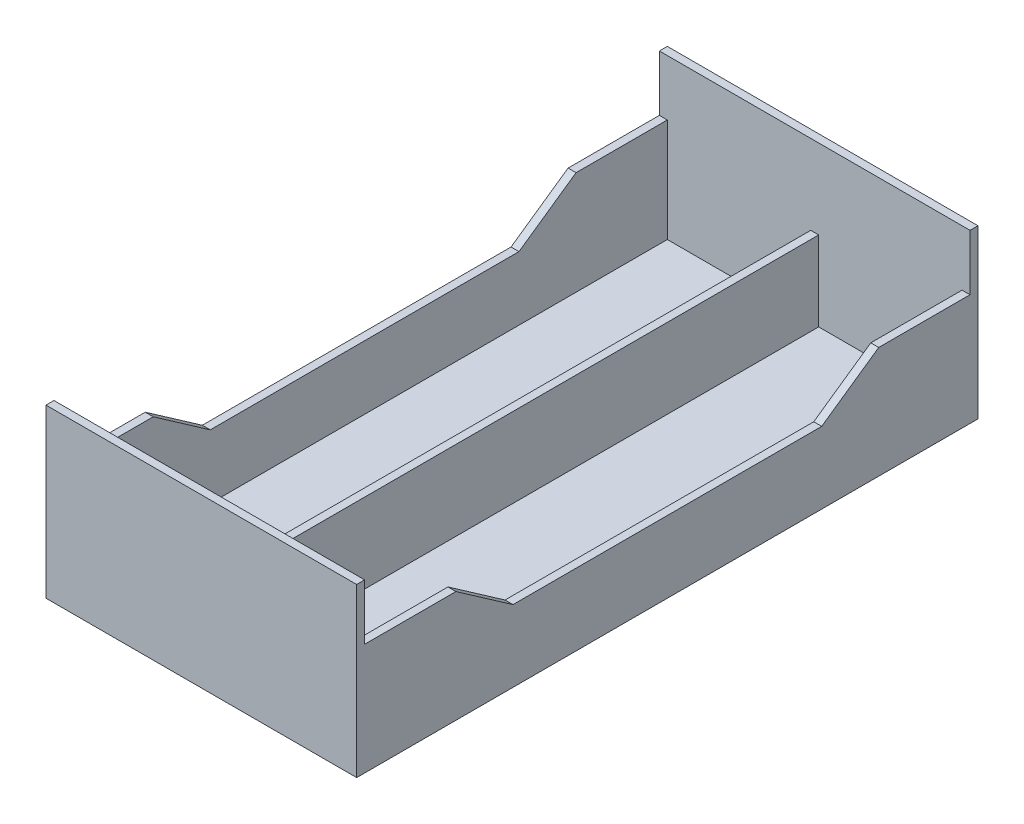
ISO-10303-21;
HEADER;
FILE_DESCRIPTION(('STEP AP214'),'2;1');
FILE_NAME('part.step','',(''),(''),'','','');
FILE_SCHEMA(('AUTOMOTIVE_DESIGN { 1 0 10303 214 1 1 1 1 }'));
ENDSEC;
DATA;
#1=APPLICATION_CONTEXT('core data for automotive mechanical design processes');
#2=APPLICATION_PROTOCOL_DEFINITION('international standard','automotive_design',2000,#1);
#3=PRODUCT_CONTEXT('',#1,'mechanical');
#4=PRODUCT('Part','Part','',(#3));
#5=PRODUCT_RELATED_PRODUCT_CATEGORY('part','',(#4));
#6=PRODUCT_DEFINITION_FORMATION('','',#4);
#7=PRODUCT_DEFINITION_CONTEXT('part definition',#1,'design');
#8=PRODUCT_DEFINITION('design','',#6,#7);
#9=PRODUCT_DEFINITION_SHAPE('','',#8);
#10=(LENGTH_UNIT() NAMED_UNIT(*) SI_UNIT(.MILLI.,.METRE.));
#11=(NAMED_UNIT(*) PLANE_ANGLE_UNIT() SI_UNIT($,.RADIAN.));
#12=(NAMED_UNIT(*) SI_UNIT($,.STERADIAN.) SOLID_ANGLE_UNIT());
#13=UNCERTAINTY_MEASURE_WITH_UNIT(LENGTH_MEASURE(1.E-05),#10,'distance_accuracy_value','');
#14=(GEOMETRIC_REPRESENTATION_CONTEXT(3) GLOBAL_UNCERTAINTY_ASSIGNED_CONTEXT((#13)) GLOBAL_UNIT_ASSIGNED_CONTEXT((#10,
#11,#12)) REPRESENTATION_CONTEXT('',''));
#15=CARTESIAN_POINT('',(0.,0.,0.));
#16=DIRECTION('',(0.,0.,1.));
#17=DIRECTION('',(1.,0.,0.));
#18=AXIS2_PLACEMENT_3D('',#15,#16,#17);
#19=CARTESIAN_POINT('',(1.,10.5,-38.));
#20=DIRECTION('',(0.,0.,-1.));
#21=DIRECTION('',(-1.,0.,0.));
#22=AXIS2_PLACEMENT_3D('',#19,#20,#21);
#23=PLANE('',#22);
#24=DIRECTION('',(0.,1.,0.));
#25=VECTOR('',#24,1.);
#26=CARTESIAN_POINT('',(20.,0.500000000000002,-38.));
#27=LINE('',#26,#25);
#28=CARTESIAN_POINT('',(20.,-9.5,-38.));
#29=VERTEX_POINT('',#28);
#30=CARTESIAN_POINT('',(20.,0.500000000000002,-38.));
#31=VERTEX_POINT('',#30);
#32=EDGE_CURVE('E201',#29,#31,#27,.T.);
#33=ORIENTED_EDGE('',*,*,#32,.F.);
#34=DIRECTION('',(-1.,0.,0.));
#35=VECTOR('',#34,1.);
#36=CARTESIAN_POINT('',(38.,-9.5,-38.));
#37=LINE('',#36,#35);
#38=CARTESIAN_POINT('',(38.,-9.5,-38.));
#39=VERTEX_POINT('',#38);
#40=EDGE_CURVE('E212',#39,#29,#37,.T.);
#41=ORIENTED_EDGE('',*,*,#40,.F.);
#42=DIRECTION('',(0.,-1.,0.));
#43=VECTOR('',#42,1.);
#44=CARTESIAN_POINT('',(38.,10.5,-38.));
#45=LINE('',#44,#43);
#46=CARTESIAN_POINT('',(38.,3.5,-38.));
#47=VERTEX_POINT('',#46);
#48=EDGE_CURVE('E234',#47,#39,#45,.T.);
#49=ORIENTED_EDGE('',*,*,#48,.F.);
#50=DIRECTION('',(1.,0.,0.));
#51=VECTOR('',#50,1.);
#52=CARTESIAN_POINT('',(38.,3.5,-38.));
#53=LINE('',#52,#51);
#54=CARTESIAN_POINT('',(39.,3.5,-38.));
#55=VERTEX_POINT('',#54);
#56=EDGE_CURVE('E298',#47,#55,#53,.T.);
#57=ORIENTED_EDGE('',*,*,#56,.T.);
#58=DIRECTION('',(0.,-1.,0.));
#59=VECTOR('',#58,1.);
#60=CARTESIAN_POINT('',(39.,10.5,-38.));
#61=LINE('',#60,#59);
#62=CARTESIAN_POINT('',(39.,10.5,-38.));
#63=VERTEX_POINT('',#62);
#64=EDGE_CURVE('E347',#63,#55,#61,.T.);
#65=ORIENTED_EDGE('',*,*,#64,.F.);
#66=DIRECTION('',(-1.,0.,0.));
#67=VECTOR('',#66,1.);
#68=CARTESIAN_POINT('',(1.,10.5,-38.));
#69=LINE('',#68,#67);
#70=CARTESIAN_POINT('',(0.,10.5,-38.));
#71=VERTEX_POINT('',#70);
#72=EDGE_CURVE('E247',#63,#71,#69,.T.);
#73=ORIENTED_EDGE('',*,*,#72,.T.);
#74=DIRECTION('',(0.,-1.,0.));
#75=VECTOR('',#74,1.);
#76=CARTESIAN_POINT('',(0.,10.5,-38.));
#77=LINE('',#76,#75);
#78=CARTESIAN_POINT('',(0.,3.5,-38.));
#79=VERTEX_POINT('',#78);
#80=EDGE_CURVE('E448',#71,#79,#77,.T.);
#81=ORIENTED_EDGE('',*,*,#80,.T.);
#82=DIRECTION('',(-1.,0.,0.));
#83=VECTOR('',#82,1.);
#84=CARTESIAN_POINT('',(1.,3.5,-38.));
#85=LINE('',#84,#83);
#86=CARTESIAN_POINT('',(1.,3.5,-38.));
#87=VERTEX_POINT('',#86);
#88=EDGE_CURVE('E244',#87,#79,#85,.T.);
#89=ORIENTED_EDGE('',*,*,#88,.F.);
#90=DIRECTION('',(0.,-1.,0.));
#91=VECTOR('',#90,1.);
#92=CARTESIAN_POINT('',(1.,10.5,-38.));
#93=LINE('',#92,#91);
#94=CARTESIAN_POINT('',(1.,-9.5,-38.));
#95=VERTEX_POINT('',#94);
#96=EDGE_CURVE('E11',#87,#95,#93,.T.);
#97=ORIENTED_EDGE('',*,*,#96,.T.);
#98=CARTESIAN_POINT('',(19.,-9.5,-38.));
#99=VERTEX_POINT('',#98);
#100=EDGE_CURVE('E221',#99,#95,#37,.T.);
#101=ORIENTED_EDGE('',*,*,#100,.F.);
#102=DIRECTION('',(0.,1.,0.));
#103=VECTOR('',#102,1.);
#104=CARTESIAN_POINT('',(19.,0.500000000000002,-38.));
#105=LINE('',#104,#103);
#106=CARTESIAN_POINT('',(19.,0.500000000000002,-38.));
#107=VERTEX_POINT('',#106);
#108=EDGE_CURVE('E50',#99,#107,#105,.T.);
#109=ORIENTED_EDGE('',*,*,#108,.T.);
#110=DIRECTION('',(-1.,0.,0.));
#111=VECTOR('',#110,1.);
#112=CARTESIAN_POINT('',(20.,0.500000000000002,-38.));
#113=LINE('',#112,#111);
#114=EDGE_CURVE('E214',#31,#107,#113,.T.);
#115=ORIENTED_EDGE('',*,*,#114,.F.);
#116=EDGE_LOOP('',(#33,#41,#49,#57,#65,#73,#81,#89,#97,#101,#109,#115));
#117=FACE_BOUND('',#116,.T.);
#118=ADVANCED_FACE('F33',(#117),#23,.F.);
#119=CARTESIAN_POINT('',(1.,10.5,38.));
#120=DIRECTION('',(0.,0.,1.));
#121=DIRECTION('',(1.,0.,0.));
#122=AXIS2_PLACEMENT_3D('',#119,#120,#121);
#123=PLANE('',#122);
#124=DIRECTION('',(0.,-1.,0.));
#125=VECTOR('',#124,1.);
#126=CARTESIAN_POINT('',(20.,-9.5,38.));
#127=LINE('',#126,#125);
#128=CARTESIAN_POINT('',(20.,0.500000000000002,38.));
#129=VERTEX_POINT('',#128);
#130=CARTESIAN_POINT('',(20.,-9.5,38.));
#131=VERTEX_POINT('',#130);
#132=EDGE_CURVE('E204',#129,#131,#127,.T.);
#133=ORIENTED_EDGE('',*,*,#132,.F.);
#134=DIRECTION('',(-1.,0.,0.));
#135=VECTOR('',#134,1.);
#136=CARTESIAN_POINT('',(20.,0.500000000000002,38.));
#137=LINE('',#136,#135);
#138=CARTESIAN_POINT('',(19.,0.500000000000002,38.));
#139=VERTEX_POINT('',#138);
#140=EDGE_CURVE('E371',#129,#139,#137,.T.);
#141=ORIENTED_EDGE('',*,*,#140,.T.);
#142=DIRECTION('',(0.,-1.,0.));
#143=VECTOR('',#142,1.);
#144=CARTESIAN_POINT('',(19.,-9.5,38.));
#145=LINE('',#144,#143);
#146=CARTESIAN_POINT('',(19.,-9.5,38.));
#147=VERTEX_POINT('',#146);
#148=EDGE_CURVE('E208',#139,#147,#145,.T.);
#149=ORIENTED_EDGE('',*,*,#148,.T.);
#150=DIRECTION('',(-1.,0.,0.));
#151=VECTOR('',#150,1.);
#152=CARTESIAN_POINT('',(38.,-9.5,38.));
#153=LINE('',#152,#151);
#154=CARTESIAN_POINT('',(1.,-9.5,38.));
#155=VERTEX_POINT('',#154);
#156=EDGE_CURVE('E388',#147,#155,#153,.T.);
#157=ORIENTED_EDGE('',*,*,#156,.T.);
#158=DIRECTION('',(0.,1.,0.));
#159=VECTOR('',#158,1.);
#160=CARTESIAN_POINT('',(1.,10.5,38.));
#161=LINE('',#160,#159);
#162=CARTESIAN_POINT('',(1.,3.5,38.));
#163=VERTEX_POINT('',#162);
#164=EDGE_CURVE('E230',#155,#163,#161,.T.);
#165=ORIENTED_EDGE('',*,*,#164,.T.);
#166=DIRECTION('',(-1.,0.,0.));
#167=VECTOR('',#166,1.);
#168=CARTESIAN_POINT('',(1.,3.5,38.));
#169=LINE('',#168,#167);
#170=CARTESIAN_POINT('',(0.,3.5,38.));
#171=VERTEX_POINT('',#170);
#172=EDGE_CURVE('E262',#163,#171,#169,.T.);
#173=ORIENTED_EDGE('',*,*,#172,.T.);
#174=DIRECTION('',(0.,1.,0.));
#175=VECTOR('',#174,1.);
#176=CARTESIAN_POINT('',(0.,10.5,38.));
#177=LINE('',#176,#175);
#178=CARTESIAN_POINT('',(0.,10.5,38.));
#179=VERTEX_POINT('',#178);
#180=EDGE_CURVE('E402',#171,#179,#177,.T.);
#181=ORIENTED_EDGE('',*,*,#180,.T.);
#182=DIRECTION('',(-1.,0.,0.));
#183=VECTOR('',#182,1.);
#184=CARTESIAN_POINT('',(1.,10.5,38.));
#185=LINE('',#184,#183);
#186=CARTESIAN_POINT('',(39.,10.5,38.));
#187=VERTEX_POINT('',#186);
#188=EDGE_CURVE('E266',#187,#179,#185,.T.);
#189=ORIENTED_EDGE('',*,*,#188,.F.);
#190=DIRECTION('',(0.,1.,0.));
#191=VECTOR('',#190,1.);
#192=CARTESIAN_POINT('',(39.,10.5,38.));
#193=LINE('',#192,#191);
#194=CARTESIAN_POINT('',(39.,3.5,38.));
#195=VERTEX_POINT('',#194);
#196=EDGE_CURVE('E329',#195,#187,#193,.T.);
#197=ORIENTED_EDGE('',*,*,#196,.F.);
#198=DIRECTION('',(1.,0.,0.));
#199=VECTOR('',#198,1.);
#200=CARTESIAN_POINT('',(38.,3.5,38.));
#201=LINE('',#200,#199);
#202=CARTESIAN_POINT('',(38.,3.5,38.));
#203=VERTEX_POINT('',#202);
#204=EDGE_CURVE('E280',#203,#195,#201,.T.);
#205=ORIENTED_EDGE('',*,*,#204,.F.);
#206=DIRECTION('',(0.,1.,0.));
#207=VECTOR('',#206,1.);
#208=CARTESIAN_POINT('',(38.,10.5,38.));
#209=LINE('',#208,#207);
#210=CARTESIAN_POINT('',(38.,-9.5,38.));
#211=VERTEX_POINT('',#210);
#212=EDGE_CURVE('E58',#211,#203,#209,.T.);
#213=ORIENTED_EDGE('',*,*,#212,.F.);
#214=EDGE_CURVE('E226',#211,#131,#153,.T.);
#215=ORIENTED_EDGE('',*,*,#214,.T.);
#216=EDGE_LOOP('',(#133,#141,#149,#157,#165,#173,#181,#189,#197,#205,#213,#215));
#217=FACE_BOUND('',#216,.T.);
#218=ADVANCED_FACE('F387',(#217),#123,.F.);
#219=CARTESIAN_POINT('',(38.,-9.5,-38.));
#220=DIRECTION('',(0.,-1.,0.));
#221=DIRECTION('',(0.,0.,-1.));
#222=AXIS2_PLACEMENT_3D('',#219,#220,#221);
#223=PLANE('',#222);
#224=DIRECTION('',(0.,0.,-1.));
#225=VECTOR('',#224,1.);
#226=CARTESIAN_POINT('',(20.,-9.5,38.));
#227=LINE('',#226,#225);
#228=EDGE_CURVE('E198',#131,#29,#227,.T.);
#229=ORIENTED_EDGE('',*,*,#228,.F.);
#230=ORIENTED_EDGE('',*,*,#214,.F.);
#231=DIRECTION('',(0.,0.,1.));
#232=VECTOR('',#231,1.);
#233=CARTESIAN_POINT('',(38.,-9.5,-38.));
#234=LINE('',#233,#232);
#235=EDGE_CURVE('E218',#39,#211,#234,.T.);
#236=ORIENTED_EDGE('',*,*,#235,.F.);
#237=ORIENTED_EDGE('',*,*,#40,.T.);
#238=EDGE_LOOP('',(#229,#230,#236,#237));
#239=FACE_BOUND('',#238,.T.);
#240=ADVANCED_FACE('F217',(#239),#223,.F.);
#241=CARTESIAN_POINT('',(1.,10.5,-39.));
#242=DIRECTION('',(0.,0.,1.));
#243=DIRECTION('',(1.,0.,0.));
#244=AXIS2_PLACEMENT_3D('',#241,#242,#243);
#245=PLANE('',#244);
#246=DIRECTION('',(0.,1.,0.));
#247=VECTOR('',#246,1.);
#248=CARTESIAN_POINT('',(0.,10.5,-39.));
#249=LINE('',#248,#247);
#250=CARTESIAN_POINT('',(0.,-10.5,-39.));
#251=VERTEX_POINT('',#250);
#252=CARTESIAN_POINT('',(0.,10.5,-39.));
#253=VERTEX_POINT('',#252);
#254=EDGE_CURVE('E220',#251,#253,#249,.T.);
#255=ORIENTED_EDGE('',*,*,#254,.T.);
#256=DIRECTION('',(-1.,0.,0.));
#257=VECTOR('',#256,1.);
#258=CARTESIAN_POINT('',(1.,10.5,-39.));
#259=LINE('',#258,#257);
#260=CARTESIAN_POINT('',(39.,10.5,-39.));
#261=VERTEX_POINT('',#260);
#262=EDGE_CURVE('E42',#261,#253,#259,.T.);
#263=ORIENTED_EDGE('',*,*,#262,.F.);
#264=DIRECTION('',(0.,1.,0.));
#265=VECTOR('',#264,1.);
#266=CARTESIAN_POINT('',(39.,10.5,-39.));
#267=LINE('',#266,#265);
#268=CARTESIAN_POINT('',(39.,-10.5,-39.));
#269=VERTEX_POINT('',#268);
#270=EDGE_CURVE('E317',#269,#261,#267,.T.);
#271=ORIENTED_EDGE('',*,*,#270,.F.);
#272=DIRECTION('',(-1.,0.,0.));
#273=VECTOR('',#272,1.);
#274=CARTESIAN_POINT('',(1.,-10.5,-39.));
#275=LINE('',#274,#273);
#276=EDGE_CURVE('E258',#269,#251,#275,.T.);
#277=ORIENTED_EDGE('',*,*,#276,.T.);
#278=EDGE_LOOP('',(#255,#263,#271,#277));
#279=FACE_BOUND('',#278,.T.);
#280=ADVANCED_FACE('F35',(#279),#245,.F.);
#281=CARTESIAN_POINT('',(1.,10.5,-39.));
#282=DIRECTION('',(0.,-1.,0.));
#283=DIRECTION('',(0.,0.,-1.));
#284=AXIS2_PLACEMENT_3D('',#281,#282,#283);
#285=PLANE('',#284);
#286=DIRECTION('',(0.,0.,1.));
#287=VECTOR('',#286,1.);
#288=CARTESIAN_POINT('',(0.,10.5,-39.));
#289=LINE('',#288,#287);
#290=EDGE_CURVE('E224',#253,#71,#289,.T.);
#291=ORIENTED_EDGE('',*,*,#290,.T.);
#292=ORIENTED_EDGE('',*,*,#72,.F.);
#293=DIRECTION('',(0.,0.,1.));
#294=VECTOR('',#293,1.);
#295=CARTESIAN_POINT('',(39.,10.5,-39.));
#296=LINE('',#295,#294);
#297=EDGE_CURVE('E295',#261,#63,#296,.T.);
#298=ORIENTED_EDGE('',*,*,#297,.F.);
#299=ORIENTED_EDGE('',*,*,#262,.T.);
#300=EDGE_LOOP('',(#291,#292,#298,#299));
#301=FACE_BOUND('',#300,.T.);
#302=ADVANCED_FACE('F443',(#301),#285,.F.);
#303=CARTESIAN_POINT('',(1.,3.5,-38.));
#304=DIRECTION('',(0.,-1.,0.));
#305=DIRECTION('',(0.,0.,-1.));
#306=AXIS2_PLACEMENT_3D('',#303,#304,#305);
#307=PLANE('',#306);
#308=DIRECTION('',(0.,0.,1.));
#309=VECTOR('',#308,1.);
#310=CARTESIAN_POINT('',(0.,3.5,-38.));
#311=LINE('',#310,#309);
#312=CARTESIAN_POINT('',(0.,3.5,-26.539616882052));
#313=VERTEX_POINT('',#312);
#314=EDGE_CURVE('E450',#79,#313,#311,.T.);
#315=ORIENTED_EDGE('',*,*,#314,.T.);
#316=DIRECTION('',(-1.,0.,0.));
#317=VECTOR('',#316,1.);
#318=CARTESIAN_POINT('',(1.,3.5,-26.539616882052));
#319=LINE('',#318,#317);
#320=CARTESIAN_POINT('',(1.,3.5,-26.539616882052));
#321=VERTEX_POINT('',#320);
#322=EDGE_CURVE('E248',#321,#313,#319,.T.);
#323=ORIENTED_EDGE('',*,*,#322,.F.);
#324=DIRECTION('',(0.,0.,1.));
#325=VECTOR('',#324,1.);
#326=CARTESIAN_POINT('',(1.,3.5,-38.));
#327=LINE('',#326,#325);
#328=EDGE_CURVE('E251',#87,#321,#327,.T.);
#329=ORIENTED_EDGE('',*,*,#328,.F.);
#330=ORIENTED_EDGE('',*,*,#88,.T.);
#331=EDGE_LOOP('',(#315,#323,#329,#330));
#332=FACE_BOUND('',#331,.T.);
#333=ADVANCED_FACE('F474',(#332),#307,.F.);
#334=CARTESIAN_POINT('',(1.,3.5,-26.539616882052));
#335=DIRECTION('',(0.,-0.819979737695976,-0.572392548665719));
#336=DIRECTION('',(0.,0.572392548665719,-0.819979737695977));
#337=AXIS2_PLACEMENT_3D('',#334,#335,#336);
#338=PLANE('',#337);
#339=DIRECTION('',(0.,-0.572392548665719,0.819979737695976));
#340=VECTOR('',#339,1.);
#341=CARTESIAN_POINT('',(0.,3.5,-26.539616882052));
#342=LINE('',#341,#340);
#343=CARTESIAN_POINT('',(0.,-1.5,-19.3768774333346));
#344=VERTEX_POINT('',#343);
#345=EDGE_CURVE('E455',#313,#344,#342,.T.);
#346=ORIENTED_EDGE('',*,*,#345,.T.);
#347=DIRECTION('',(-1.,0.,0.));
#348=VECTOR('',#347,1.);
#349=CARTESIAN_POINT('',(1.,-1.5,-19.3768774333346));
#350=LINE('',#349,#348);
#351=CARTESIAN_POINT('',(1.,-1.5,-19.3768774333346));
#352=VERTEX_POINT('',#351);
#353=EDGE_CURVE('E433',#352,#344,#350,.T.);
#354=ORIENTED_EDGE('',*,*,#353,.F.);
#355=DIRECTION('',(0.,-0.572392548665719,0.819979737695976));
#356=VECTOR('',#355,1.);
#357=CARTESIAN_POINT('',(1.,3.5,-26.539616882052));
#358=LINE('',#357,#356);
#359=EDGE_CURVE('E236',#321,#352,#358,.T.);
#360=ORIENTED_EDGE('',*,*,#359,.F.);
#361=ORIENTED_EDGE('',*,*,#322,.T.);
#362=EDGE_LOOP('',(#346,#354,#360,#361));
#363=FACE_BOUND('',#362,.T.);
#364=ADVANCED_FACE('F470',(#363),#338,.F.);
#365=CARTESIAN_POINT('',(1.,-1.5,19.3768774333346));
#366=DIRECTION('',(0.,-1.,0.));
#367=DIRECTION('',(0.,0.,-1.));
#368=AXIS2_PLACEMENT_3D('',#365,#366,#367);
#369=PLANE('',#368);
#370=DIRECTION('',(0.,0.,1.));
#371=VECTOR('',#370,1.);
#372=CARTESIAN_POINT('',(0.,-1.5,19.3768774333346));
#373=LINE('',#372,#371);
#374=CARTESIAN_POINT('',(0.,-1.5,19.3768774333346));
#375=VERTEX_POINT('',#374);
#376=EDGE_CURVE('E457',#344,#375,#373,.T.);
#377=ORIENTED_EDGE('',*,*,#376,.T.);
#378=DIRECTION('',(-1.,0.,0.));
#379=VECTOR('',#378,1.);
#380=CARTESIAN_POINT('',(1.,-1.5,19.3768774333346));
#381=LINE('',#380,#379);
#382=CARTESIAN_POINT('',(1.,-1.5,19.3768774333346));
#383=VERTEX_POINT('',#382);
#384=EDGE_CURVE('E430',#383,#375,#381,.T.);
#385=ORIENTED_EDGE('',*,*,#384,.F.);
#386=DIRECTION('',(0.,0.,1.));
#387=VECTOR('',#386,1.);
#388=CARTESIAN_POINT('',(1.,-1.5,19.3768774333346));
#389=LINE('',#388,#387);
#390=EDGE_CURVE('E467',#352,#383,#389,.T.);
#391=ORIENTED_EDGE('',*,*,#390,.F.);
#392=ORIENTED_EDGE('',*,*,#353,.T.);
#393=EDGE_LOOP('',(#377,#385,#391,#392));
#394=FACE_BOUND('',#393,.T.);
#395=ADVANCED_FACE('F464',(#394),#369,.F.);
#396=CARTESIAN_POINT('',(1.,3.5,26.539616882052));
#397=DIRECTION('',(0.,-0.819979737695976,0.572392548665719));
#398=DIRECTION('',(0.,-0.572392548665719,-0.819979737695977));
#399=AXIS2_PLACEMENT_3D('',#396,#397,#398);
#400=PLANE('',#399);
#401=DIRECTION('',(0.,0.572392548665719,0.819979737695976));
#402=VECTOR('',#401,1.);
#403=CARTESIAN_POINT('',(0.,3.5,26.539616882052));
#404=LINE('',#403,#402);
#405=CARTESIAN_POINT('',(0.,3.5,26.539616882052));
#406=VERTEX_POINT('',#405);
#407=EDGE_CURVE('E414',#375,#406,#404,.T.);
#408=ORIENTED_EDGE('',*,*,#407,.T.);
#409=DIRECTION('',(-1.,0.,0.));
#410=VECTOR('',#409,1.);
#411=CARTESIAN_POINT('',(1.,3.5,26.539616882052));
#412=LINE('',#411,#410);
#413=CARTESIAN_POINT('',(1.,3.5,26.539616882052));
#414=VERTEX_POINT('',#413);
#415=EDGE_CURVE('E265',#414,#406,#412,.T.);
#416=ORIENTED_EDGE('',*,*,#415,.F.);
#417=DIRECTION('',(0.,0.572392548665719,0.819979737695976));
#418=VECTOR('',#417,1.);
#419=CARTESIAN_POINT('',(1.,3.5,26.539616882052));
#420=LINE('',#419,#418);
#421=EDGE_CURVE('E259',#383,#414,#420,.T.);
#422=ORIENTED_EDGE('',*,*,#421,.F.);
#423=ORIENTED_EDGE('',*,*,#384,.T.);
#424=EDGE_LOOP('',(#408,#416,#422,#423));
#425=FACE_BOUND('',#424,.T.);
#426=ADVANCED_FACE('F459',(#425),#400,.F.);
#427=CARTESIAN_POINT('',(1.,3.5,38.));
#428=DIRECTION('',(0.,-1.,0.));
#429=DIRECTION('',(0.,0.,-1.));
#430=AXIS2_PLACEMENT_3D('',#427,#428,#429);
#431=PLANE('',#430);
#432=DIRECTION('',(0.,0.,1.));
#433=VECTOR('',#432,1.);
#434=CARTESIAN_POINT('',(0.,3.5,38.));
#435=LINE('',#434,#433);
#436=EDGE_CURVE('E400',#406,#171,#435,.T.);
#437=ORIENTED_EDGE('',*,*,#436,.T.);
#438=ORIENTED_EDGE('',*,*,#172,.F.);
#439=DIRECTION('',(0.,0.,1.));
#440=VECTOR('',#439,1.);
#441=CARTESIAN_POINT('',(1.,3.5,38.));
#442=LINE('',#441,#440);
#443=EDGE_CURVE('E256',#414,#163,#442,.T.);
#444=ORIENTED_EDGE('',*,*,#443,.F.);
#445=ORIENTED_EDGE('',*,*,#415,.T.);
#446=EDGE_LOOP('',(#437,#438,#444,#445));
#447=FACE_BOUND('',#446,.T.);
#448=ADVANCED_FACE('F398',(#447),#431,.F.);
#449=CARTESIAN_POINT('',(1.,10.5,39.));
#450=DIRECTION('',(0.,-1.,0.));
#451=DIRECTION('',(0.,0.,-1.));
#452=AXIS2_PLACEMENT_3D('',#449,#450,#451);
#453=PLANE('',#452);
#454=DIRECTION('',(0.,0.,1.));
#455=VECTOR('',#454,1.);
#456=CARTESIAN_POINT('',(0.,10.5,39.));
#457=LINE('',#456,#455);
#458=CARTESIAN_POINT('',(0.,10.5,39.));
#459=VERTEX_POINT('',#458);
#460=EDGE_CURVE('E410',#179,#459,#457,.T.);
#461=ORIENTED_EDGE('',*,*,#460,.T.);
#462=DIRECTION('',(-1.,0.,0.));
#463=VECTOR('',#462,1.);
#464=CARTESIAN_POINT('',(1.,10.5,39.));
#465=LINE('',#464,#463);
#466=CARTESIAN_POINT('',(39.,10.5,39.));
#467=VERTEX_POINT('',#466);
#468=EDGE_CURVE('E425',#467,#459,#465,.T.);
#469=ORIENTED_EDGE('',*,*,#468,.F.);
#470=DIRECTION('',(0.,0.,1.));
#471=VECTOR('',#470,1.);
#472=CARTESIAN_POINT('',(39.,10.5,39.));
#473=LINE('',#472,#471);
#474=EDGE_CURVE('E326',#187,#467,#473,.T.);
#475=ORIENTED_EDGE('',*,*,#474,.F.);
#476=ORIENTED_EDGE('',*,*,#188,.T.);
#477=EDGE_LOOP('',(#461,#469,#475,#476));
#478=FACE_BOUND('',#477,.T.);
#479=ADVANCED_FACE('F525',(#478),#453,.F.);
#480=CARTESIAN_POINT('',(1.,10.5,39.));
#481=DIRECTION('',(0.,0.,-1.));
#482=DIRECTION('',(-1.,0.,0.));
#483=AXIS2_PLACEMENT_3D('',#480,#481,#482);
#484=PLANE('',#483);
#485=DIRECTION('',(0.,-1.,0.));
#486=VECTOR('',#485,1.);
#487=CARTESIAN_POINT('',(0.,10.5,39.));
#488=LINE('',#487,#486);
#489=CARTESIAN_POINT('',(0.,-10.5,39.));
#490=VERTEX_POINT('',#489);
#491=EDGE_CURVE('E412',#459,#490,#488,.T.);
#492=ORIENTED_EDGE('',*,*,#491,.T.);
#493=DIRECTION('',(-1.,0.,0.));
#494=VECTOR('',#493,1.);
#495=CARTESIAN_POINT('',(1.,-10.5,39.));
#496=LINE('',#495,#494);
#497=CARTESIAN_POINT('',(39.,-10.5,39.));
#498=VERTEX_POINT('',#497);
#499=EDGE_CURVE('E422',#498,#490,#496,.T.);
#500=ORIENTED_EDGE('',*,*,#499,.F.);
#501=DIRECTION('',(0.,-1.,0.));
#502=VECTOR('',#501,1.);
#503=CARTESIAN_POINT('',(39.,10.5,39.));
#504=LINE('',#503,#502);
#505=EDGE_CURVE('E323',#467,#498,#504,.T.);
#506=ORIENTED_EDGE('',*,*,#505,.F.);
#507=ORIENTED_EDGE('',*,*,#468,.T.);
#508=EDGE_LOOP('',(#492,#500,#506,#507));
#509=FACE_BOUND('',#508,.T.);
#510=ADVANCED_FACE('F521',(#509),#484,.F.);
#511=CARTESIAN_POINT('',(1.,-10.5,39.));
#512=DIRECTION('',(0.,1.,0.));
#513=DIRECTION('',(0.,0.,1.));
#514=AXIS2_PLACEMENT_3D('',#511,#512,#513);
#515=PLANE('',#514);
#516=DIRECTION('',(0.,0.,-1.));
#517=VECTOR('',#516,1.);
#518=CARTESIAN_POINT('',(0.,-10.5,39.));
#519=LINE('',#518,#517);
#520=EDGE_CURVE('E253',#490,#251,#519,.T.);
#521=ORIENTED_EDGE('',*,*,#520,.T.);
#522=ORIENTED_EDGE('',*,*,#276,.F.);
#523=DIRECTION('',(0.,0.,-1.));
#524=VECTOR('',#523,1.);
#525=CARTESIAN_POINT('',(39.,-10.5,39.));
#526=LINE('',#525,#524);
#527=EDGE_CURVE('E320',#498,#269,#526,.T.);
#528=ORIENTED_EDGE('',*,*,#527,.F.);
#529=ORIENTED_EDGE('',*,*,#499,.T.);
#530=EDGE_LOOP('',(#521,#522,#528,#529));
#531=FACE_BOUND('',#530,.T.);
#532=ADVANCED_FACE('F517',(#531),#515,.F.);
#533=CARTESIAN_POINT('',(1.,0.,0.));
#534=DIRECTION('',(1.,0.,0.));
#535=DIRECTION('',(0.,0.,-1.));
#536=AXIS2_PLACEMENT_3D('',#533,#534,#535);
#537=PLANE('',#536);
#538=ORIENTED_EDGE('',*,*,#164,.F.);
#539=DIRECTION('',(0.,0.,1.));
#540=VECTOR('',#539,1.);
#541=CARTESIAN_POINT('',(1.,-9.5,-38.));
#542=LINE('',#541,#540);
#543=EDGE_CURVE('E235',#95,#155,#542,.T.);
#544=ORIENTED_EDGE('',*,*,#543,.F.);
#545=ORIENTED_EDGE('',*,*,#96,.F.);
#546=ORIENTED_EDGE('',*,*,#328,.T.);
#547=ORIENTED_EDGE('',*,*,#359,.T.);
#548=ORIENTED_EDGE('',*,*,#390,.T.);
#549=ORIENTED_EDGE('',*,*,#421,.T.);
#550=ORIENTED_EDGE('',*,*,#443,.T.);
#551=EDGE_LOOP('',(#538,#544,#545,#546,#547,#548,#549,#550));
#552=FACE_BOUND('',#551,.T.);
#553=ADVANCED_FACE('F391',(#552),#537,.T.);
#554=CARTESIAN_POINT('',(0.,0.,0.));
#555=DIRECTION('',(1.,0.,0.));
#556=DIRECTION('',(0.,0.,-1.));
#557=AXIS2_PLACEMENT_3D('',#554,#555,#556);
#558=PLANE('',#557);
#559=ORIENTED_EDGE('',*,*,#254,.F.);
#560=ORIENTED_EDGE('',*,*,#520,.F.);
#561=ORIENTED_EDGE('',*,*,#491,.F.);
#562=ORIENTED_EDGE('',*,*,#460,.F.);
#563=ORIENTED_EDGE('',*,*,#180,.F.);
#564=ORIENTED_EDGE('',*,*,#436,.F.);
#565=ORIENTED_EDGE('',*,*,#407,.F.);
#566=ORIENTED_EDGE('',*,*,#376,.F.);
#567=ORIENTED_EDGE('',*,*,#345,.F.);
#568=ORIENTED_EDGE('',*,*,#314,.F.);
#569=ORIENTED_EDGE('',*,*,#80,.F.);
#570=ORIENTED_EDGE('',*,*,#290,.F.);
#571=EDGE_LOOP('',(#559,#560,#561,#562,#563,#564,#565,#566,#567,#568,#569,#570));
#572=FACE_BOUND('',#571,.T.);
#573=ADVANCED_FACE('F407',(#572),#558,.F.);
#574=ORIENTED_EDGE('',*,*,#156,.F.);
#575=DIRECTION('',(0.,0.,-1.));
#576=VECTOR('',#575,1.);
#577=CARTESIAN_POINT('',(19.,-9.5,38.));
#578=LINE('',#577,#576);
#579=EDGE_CURVE('E379',#147,#99,#578,.T.);
#580=ORIENTED_EDGE('',*,*,#579,.T.);
#581=ORIENTED_EDGE('',*,*,#100,.T.);
#582=ORIENTED_EDGE('',*,*,#543,.T.);
#583=EDGE_LOOP('',(#574,#580,#581,#582));
#584=FACE_BOUND('',#583,.T.);
#585=ADVANCED_FACE('F477',(#584),#223,.F.);
#586=CARTESIAN_POINT('',(38.,3.5,38.));
#587=DIRECTION('',(0.,1.,0.));
#588=DIRECTION('',(0.,0.,1.));
#589=AXIS2_PLACEMENT_3D('',#586,#587,#588);
#590=PLANE('',#589);
#591=DIRECTION('',(0.,0.,1.));
#592=VECTOR('',#591,1.);
#593=CARTESIAN_POINT('',(39.,3.5,38.));
#594=LINE('',#593,#592);
#595=CARTESIAN_POINT('',(39.,3.5,26.539616882052));
#596=VERTEX_POINT('',#595);
#597=EDGE_CURVE('E332',#596,#195,#594,.T.);
#598=ORIENTED_EDGE('',*,*,#597,.F.);
#599=DIRECTION('',(1.,0.,0.));
#600=VECTOR('',#599,1.);
#601=CARTESIAN_POINT('',(38.,3.5,26.539616882052));
#602=LINE('',#601,#600);
#603=CARTESIAN_POINT('',(38.,3.5,26.539616882052));
#604=VERTEX_POINT('',#603);
#605=EDGE_CURVE('E276',#604,#596,#602,.T.);
#606=ORIENTED_EDGE('',*,*,#605,.F.);
#607=DIRECTION('',(0.,0.,1.));
#608=VECTOR('',#607,1.);
#609=CARTESIAN_POINT('',(38.,3.5,38.));
#610=LINE('',#609,#608);
#611=EDGE_CURVE('E292',#604,#203,#610,.T.);
#612=ORIENTED_EDGE('',*,*,#611,.T.);
#613=ORIENTED_EDGE('',*,*,#204,.T.);
#614=EDGE_LOOP('',(#598,#606,#612,#613));
#615=FACE_BOUND('',#614,.T.);
#616=ADVANCED_FACE('F508',(#615),#590,.T.);
#617=CARTESIAN_POINT('',(38.,3.5,26.539616882052));
#618=DIRECTION('',(0.,0.819979737695976,-0.572392548665719));
#619=DIRECTION('',(0.,0.572392548665719,0.819979737695977));
#620=AXIS2_PLACEMENT_3D('',#617,#618,#619);
#621=PLANE('',#620);
#622=DIRECTION('',(0.,0.572392548665719,0.819979737695976));
#623=VECTOR('',#622,1.);
#624=CARTESIAN_POINT('',(39.,3.5,26.539616882052));
#625=LINE('',#624,#623);
#626=CARTESIAN_POINT('',(39.,-1.5,19.3768774333346));
#627=VERTEX_POINT('',#626);
#628=EDGE_CURVE('E335',#627,#596,#625,.T.);
#629=ORIENTED_EDGE('',*,*,#628,.F.);
#630=DIRECTION('',(1.,0.,0.));
#631=VECTOR('',#630,1.);
#632=CARTESIAN_POINT('',(38.,-1.5,19.3768774333346));
#633=LINE('',#632,#631);
#634=CARTESIAN_POINT('',(38.,-1.5,19.3768774333346));
#635=VERTEX_POINT('',#634);
#636=EDGE_CURVE('E288',#635,#627,#633,.T.);
#637=ORIENTED_EDGE('',*,*,#636,.F.);
#638=DIRECTION('',(0.,0.572392548665719,0.819979737695976));
#639=VECTOR('',#638,1.);
#640=CARTESIAN_POINT('',(38.,3.5,26.539616882052));
#641=LINE('',#640,#639);
#642=EDGE_CURVE('E294',#635,#604,#641,.T.);
#643=ORIENTED_EDGE('',*,*,#642,.T.);
#644=ORIENTED_EDGE('',*,*,#605,.T.);
#645=EDGE_LOOP('',(#629,#637,#643,#644));
#646=FACE_BOUND('',#645,.T.);
#647=ADVANCED_FACE('F362',(#646),#621,.T.);
#648=CARTESIAN_POINT('',(38.,-1.5,19.3768774333346));
#649=DIRECTION('',(0.,1.,0.));
#650=DIRECTION('',(0.,0.,1.));
#651=AXIS2_PLACEMENT_3D('',#648,#649,#650);
#652=PLANE('',#651);
#653=DIRECTION('',(0.,0.,1.));
#654=VECTOR('',#653,1.);
#655=CARTESIAN_POINT('',(39.,-1.5,19.3768774333346));
#656=LINE('',#655,#654);
#657=CARTESIAN_POINT('',(39.,-1.5,-19.3768774333346));
#658=VERTEX_POINT('',#657);
#659=EDGE_CURVE('E338',#658,#627,#656,.T.);
#660=ORIENTED_EDGE('',*,*,#659,.F.);
#661=DIRECTION('',(1.,0.,0.));
#662=VECTOR('',#661,1.);
#663=CARTESIAN_POINT('',(38.,-1.5,-19.3768774333346));
#664=LINE('',#663,#662);
#665=CARTESIAN_POINT('',(38.,-1.5,-19.3768774333346));
#666=VERTEX_POINT('',#665);
#667=EDGE_CURVE('E353',#666,#658,#664,.T.);
#668=ORIENTED_EDGE('',*,*,#667,.F.);
#669=DIRECTION('',(0.,0.,1.));
#670=VECTOR('',#669,1.);
#671=CARTESIAN_POINT('',(38.,-1.5,19.3768774333346));
#672=LINE('',#671,#670);
#673=EDGE_CURVE('E309',#666,#635,#672,.T.);
#674=ORIENTED_EDGE('',*,*,#673,.T.);
#675=ORIENTED_EDGE('',*,*,#636,.T.);
#676=EDGE_LOOP('',(#660,#668,#674,#675));
#677=FACE_BOUND('',#676,.T.);
#678=ADVANCED_FACE('F357',(#677),#652,.T.);
#679=CARTESIAN_POINT('',(38.,3.5,-26.539616882052));
#680=DIRECTION('',(0.,0.819979737695976,0.572392548665719));
#681=DIRECTION('',(0.,-0.572392548665719,0.819979737695977));
#682=AXIS2_PLACEMENT_3D('',#679,#680,#681);
#683=PLANE('',#682);
#684=DIRECTION('',(0.,-0.572392548665719,0.819979737695976));
#685=VECTOR('',#684,1.);
#686=CARTESIAN_POINT('',(39.,3.5,-26.539616882052));
#687=LINE('',#686,#685);
#688=CARTESIAN_POINT('',(39.,3.5,-26.539616882052));
#689=VERTEX_POINT('',#688);
#690=EDGE_CURVE('E341',#689,#658,#687,.T.);
#691=ORIENTED_EDGE('',*,*,#690,.F.);
#692=DIRECTION('',(1.,0.,0.));
#693=VECTOR('',#692,1.);
#694=CARTESIAN_POINT('',(38.,3.5,-26.539616882052));
#695=LINE('',#694,#693);
#696=CARTESIAN_POINT('',(38.,3.5,-26.539616882052));
#697=VERTEX_POINT('',#696);
#698=EDGE_CURVE('E300',#697,#689,#695,.T.);
#699=ORIENTED_EDGE('',*,*,#698,.F.);
#700=DIRECTION('',(0.,-0.572392548665719,0.819979737695976));
#701=VECTOR('',#700,1.);
#702=CARTESIAN_POINT('',(38.,3.5,-26.539616882052));
#703=LINE('',#702,#701);
#704=EDGE_CURVE('E304',#697,#666,#703,.T.);
#705=ORIENTED_EDGE('',*,*,#704,.T.);
#706=ORIENTED_EDGE('',*,*,#667,.T.);
#707=EDGE_LOOP('',(#691,#699,#705,#706));
#708=FACE_BOUND('',#707,.T.);
#709=ADVANCED_FACE('F367',(#708),#683,.T.);
#710=CARTESIAN_POINT('',(38.,3.5,-38.));
#711=DIRECTION('',(0.,1.,0.));
#712=DIRECTION('',(0.,0.,1.));
#713=AXIS2_PLACEMENT_3D('',#710,#711,#712);
#714=PLANE('',#713);
#715=DIRECTION('',(0.,0.,1.));
#716=VECTOR('',#715,1.);
#717=CARTESIAN_POINT('',(39.,3.5,-38.));
#718=LINE('',#717,#716);
#719=EDGE_CURVE('E344',#55,#689,#718,.T.);
#720=ORIENTED_EDGE('',*,*,#719,.F.);
#721=ORIENTED_EDGE('',*,*,#56,.F.);
#722=DIRECTION('',(0.,0.,1.));
#723=VECTOR('',#722,1.);
#724=CARTESIAN_POINT('',(38.,3.5,-38.));
#725=LINE('',#724,#723);
#726=EDGE_CURVE('E301',#47,#697,#725,.T.);
#727=ORIENTED_EDGE('',*,*,#726,.T.);
#728=ORIENTED_EDGE('',*,*,#698,.T.);
#729=EDGE_LOOP('',(#720,#721,#727,#728));
#730=FACE_BOUND('',#729,.T.);
#731=ADVANCED_FACE('F630',(#730),#714,.T.);
#732=CARTESIAN_POINT('',(38.,0.,0.));
#733=DIRECTION('',(-1.,0.,0.));
#734=DIRECTION('',(0.,0.,-1.));
#735=AXIS2_PLACEMENT_3D('',#732,#733,#734);
#736=PLANE('',#735);
#737=ORIENTED_EDGE('',*,*,#726,.F.);
#738=ORIENTED_EDGE('',*,*,#48,.T.);
#739=ORIENTED_EDGE('',*,*,#235,.T.);
#740=ORIENTED_EDGE('',*,*,#212,.T.);
#741=ORIENTED_EDGE('',*,*,#611,.F.);
#742=ORIENTED_EDGE('',*,*,#642,.F.);
#743=ORIENTED_EDGE('',*,*,#673,.F.);
#744=ORIENTED_EDGE('',*,*,#704,.F.);
#745=EDGE_LOOP('',(#737,#738,#739,#740,#741,#742,#743,#744));
#746=FACE_BOUND('',#745,.T.);
#747=ADVANCED_FACE('F368',(#746),#736,.T.);
#748=CARTESIAN_POINT('',(39.,0.,0.));
#749=DIRECTION('',(-1.,0.,0.));
#750=DIRECTION('',(0.,0.,-1.));
#751=AXIS2_PLACEMENT_3D('',#748,#749,#750);
#752=PLANE('',#751);
#753=ORIENTED_EDGE('',*,*,#270,.T.);
#754=ORIENTED_EDGE('',*,*,#297,.T.);
#755=ORIENTED_EDGE('',*,*,#64,.T.);
#756=ORIENTED_EDGE('',*,*,#719,.T.);
#757=ORIENTED_EDGE('',*,*,#690,.T.);
#758=ORIENTED_EDGE('',*,*,#659,.T.);
#759=ORIENTED_EDGE('',*,*,#628,.T.);
#760=ORIENTED_EDGE('',*,*,#597,.T.);
#761=ORIENTED_EDGE('',*,*,#196,.T.);
#762=ORIENTED_EDGE('',*,*,#474,.T.);
#763=ORIENTED_EDGE('',*,*,#505,.T.);
#764=ORIENTED_EDGE('',*,*,#527,.T.);
#765=EDGE_LOOP('',(#753,#754,#755,#756,#757,#758,#759,#760,#761,#762,#763,#764));
#766=FACE_BOUND('',#765,.T.);
#767=ADVANCED_FACE('F364',(#766),#752,.F.);
#768=CARTESIAN_POINT('',(20.,0.500000000000002,38.));
#769=DIRECTION('',(0.,-1.,0.));
#770=DIRECTION('',(0.,0.,-1.));
#771=AXIS2_PLACEMENT_3D('',#768,#769,#770);
#772=PLANE('',#771);
#773=DIRECTION('',(0.,0.,1.));
#774=VECTOR('',#773,1.);
#775=CARTESIAN_POINT('',(19.,0.500000000000002,38.));
#776=LINE('',#775,#774);
#777=EDGE_CURVE('E376',#107,#139,#776,.T.);
#778=ORIENTED_EDGE('',*,*,#777,.T.);
#779=ORIENTED_EDGE('',*,*,#140,.F.);
#780=DIRECTION('',(0.,0.,1.));
#781=VECTOR('',#780,1.);
#782=CARTESIAN_POINT('',(20.,0.500000000000002,38.));
#783=LINE('',#782,#781);
#784=EDGE_CURVE('E215',#31,#129,#783,.T.);
#785=ORIENTED_EDGE('',*,*,#784,.F.);
#786=ORIENTED_EDGE('',*,*,#114,.T.);
#787=EDGE_LOOP('',(#778,#779,#785,#786));
#788=FACE_BOUND('',#787,.T.);
#789=ADVANCED_FACE('F384',(#788),#772,.F.);
#790=CARTESIAN_POINT('',(20.,0.,0.));
#791=DIRECTION('',(-1.,0.,0.));
#792=DIRECTION('',(0.,0.,1.));
#793=AXIS2_PLACEMENT_3D('',#790,#791,#792);
#794=PLANE('',#793);
#795=ORIENTED_EDGE('',*,*,#228,.T.);
#796=ORIENTED_EDGE('',*,*,#32,.T.);
#797=ORIENTED_EDGE('',*,*,#784,.T.);
#798=ORIENTED_EDGE('',*,*,#132,.T.);
#799=EDGE_LOOP('',(#795,#796,#797,#798));
#800=FACE_BOUND('',#799,.T.);
#801=ADVANCED_FACE('F200',(#800),#794,.F.);
#802=CARTESIAN_POINT('',(19.,0.,0.));
#803=DIRECTION('',(-1.,0.,0.));
#804=DIRECTION('',(0.,0.,1.));
#805=AXIS2_PLACEMENT_3D('',#802,#803,#804);
#806=PLANE('',#805);
#807=ORIENTED_EDGE('',*,*,#579,.F.);
#808=ORIENTED_EDGE('',*,*,#148,.F.);
#809=ORIENTED_EDGE('',*,*,#777,.F.);
#810=ORIENTED_EDGE('',*,*,#108,.F.);
#811=EDGE_LOOP('',(#807,#808,#809,#810));
#812=FACE_BOUND('',#811,.T.);
#813=ADVANCED_FACE('F478',(#812),#806,.T.);
#814=CLOSED_SHELL('',(#118,#218,#240,#280,#302,#333,#364,#395,#426,#448,#479,#510,#532,#553,
#573,#585,#616,#647,#678,#709,#731,#747,#767,#789,#801,#813));
#815=MANIFOLD_SOLID_BREP('B2',#814);
#816=ADVANCED_BREP_SHAPE_REPRESENTATION('',(#18,#815),#14);
#817=SHAPE_DEFINITION_REPRESENTATION(#9,#816);
ENDSEC;
END-ISO-10303-21;
